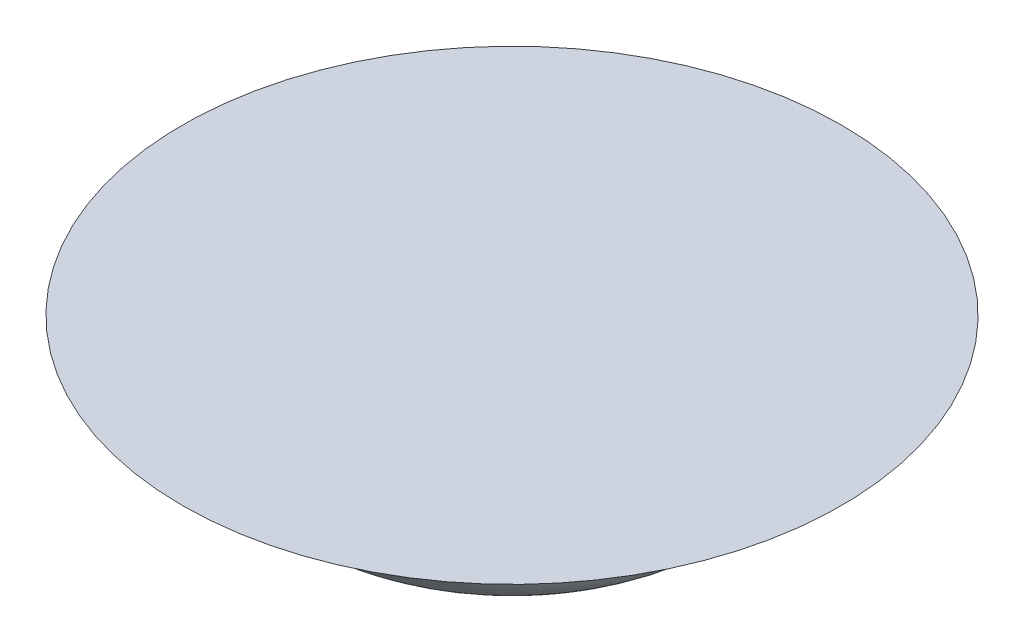
ISO-10303-21;
HEADER;
FILE_DESCRIPTION(('STEP AP214'),'2;1');
FILE_NAME('part.step','',(''),(''),'','','');
FILE_SCHEMA(('AUTOMOTIVE_DESIGN { 1 0 10303 214 1 1 1 1 }'));
ENDSEC;
DATA;
#1=APPLICATION_CONTEXT('core data for automotive mechanical design processes');
#2=APPLICATION_PROTOCOL_DEFINITION('international standard','automotive_design',2000,#1);
#3=PRODUCT_CONTEXT('',#1,'mechanical');
#4=PRODUCT('Part','Part','',(#3));
#5=PRODUCT_RELATED_PRODUCT_CATEGORY('part','',(#4));
#6=PRODUCT_DEFINITION_FORMATION('','',#4);
#7=PRODUCT_DEFINITION_CONTEXT('part definition',#1,'design');
#8=PRODUCT_DEFINITION('design','',#6,#7);
#9=PRODUCT_DEFINITION_SHAPE('','',#8);
#10=(LENGTH_UNIT() NAMED_UNIT(*) SI_UNIT(.MILLI.,.METRE.));
#11=(NAMED_UNIT(*) PLANE_ANGLE_UNIT() SI_UNIT($,.RADIAN.));
#12=(NAMED_UNIT(*) SI_UNIT($,.STERADIAN.) SOLID_ANGLE_UNIT());
#13=UNCERTAINTY_MEASURE_WITH_UNIT(LENGTH_MEASURE(1.E-05),#10,'distance_accuracy_value','');
#14=(GEOMETRIC_REPRESENTATION_CONTEXT(3) GLOBAL_UNCERTAINTY_ASSIGNED_CONTEXT((#13)) GLOBAL_UNIT_ASSIGNED_CONTEXT((#10,
#11,#12)) REPRESENTATION_CONTEXT('',''));
#15=CARTESIAN_POINT('',(0.,0.,0.));
#16=DIRECTION('',(0.,0.,1.));
#17=DIRECTION('',(1.,0.,0.));
#18=AXIS2_PLACEMENT_3D('',#15,#16,#17);
#19=CARTESIAN_POINT('',(0.,-5.,0.));
#20=DIRECTION('',(0.,-1.,0.));
#21=DIRECTION('',(0.,0.,-1.));
#22=AXIS2_PLACEMENT_3D('',#19,#20,#21);
#23=PLANE('',#22);
#24=CARTESIAN_POINT('',(0.,-5.,0.));
#25=DIRECTION('',(0.,-1.,0.));
#26=DIRECTION('',(0.,0.,-1.));
#27=AXIS2_PLACEMENT_3D('',#24,#25,#26);
#28=CIRCLE('',#27,7.);
#29=CARTESIAN_POINT('',(0.,-5.,-7.));
#30=VERTEX_POINT('',#29);
#31=EDGE_CURVE('E37',#30,#30,#28,.T.);
#32=ORIENTED_EDGE('',*,*,#31,.T.);
#33=EDGE_LOOP('',(#32));
#34=FACE_BOUND('',#33,.T.);
#35=ADVANCED_FACE('F30',(#34),#23,.T.);
#36=CARTESIAN_POINT('',(0.,-2.,0.));
#37=DIRECTION('',(0.,-1.,0.));
#38=DIRECTION('',(0.,0.,-1.));
#39=AXIS2_PLACEMENT_3D('',#36,#37,#38);
#40=TOROIDAL_SURFACE('',#39,7.,3.);
#41=CARTESIAN_POINT('',(0.,-3.125,0.));
#42=DIRECTION('',(0.,1.,0.));
#43=DIRECTION('',(0.,0.,1.));
#44=AXIS2_PLACEMENT_3D('',#41,#42,#43);
#45=CIRCLE('',#44,9.78107443266087);
#46=CARTESIAN_POINT('',(0.,-3.125,9.78107443266087));
#47=VERTEX_POINT('',#46);
#48=EDGE_CURVE('E10',#47,#47,#45,.F.);
#49=ORIENTED_EDGE('',*,*,#48,.T.);
#50=EDGE_LOOP('',(#49));
#51=FACE_BOUND('',#50,.T.);
#52=ORIENTED_EDGE('',*,*,#31,.F.);
#53=EDGE_LOOP('',(#52));
#54=FACE_BOUND('',#53,.T.);
#55=ADVANCED_FACE('F56',(#51,#54),#40,.T.);
#56=CARTESIAN_POINT('',(0.,-5.,0.));
#57=DIRECTION('',(0.,1.,0.));
#58=DIRECTION('',(0.,0.,1.));
#59=AXIS2_PLACEMENT_3D('',#56,#57,#58);
#60=TOROIDAL_SURFACE('',#59,14.4161984870957,5.);
#61=CARTESIAN_POINT('',(0.,0.,0.));
#62=DIRECTION('',(0.,1.,0.));
#63=DIRECTION('',(0.,0.,1.));
#64=AXIS2_PLACEMENT_3D('',#61,#62,#63);
#65=CIRCLE('',#64,14.4161984870957);
#66=CARTESIAN_POINT('',(0.,0.,14.4161984870957));
#67=VERTEX_POINT('',#66);
#68=EDGE_CURVE('E41',#67,#67,#65,.F.);
#69=ORIENTED_EDGE('',*,*,#68,.T.);
#70=EDGE_LOOP('',(#69));
#71=FACE_BOUND('',#70,.T.);
#72=ORIENTED_EDGE('',*,*,#48,.F.);
#73=EDGE_LOOP('',(#72));
#74=FACE_BOUND('',#73,.T.);
#75=ADVANCED_FACE('F32',(#71,#74),#60,.F.);
#76=CARTESIAN_POINT('',(-101.845255910092,0.,60.));
#77=DIRECTION('',(0.,-1.,0.));
#78=DIRECTION('',(0.,0.,-1.));
#79=AXIS2_PLACEMENT_3D('',#76,#77,#78);
#80=PLANE('',#79);
#81=ORIENTED_EDGE('',*,*,#68,.F.);
#82=EDGE_LOOP('',(#81));
#83=FACE_BOUND('',#82,.T.);
#84=ADVANCED_FACE('F50',(#83),#80,.F.);
#85=CLOSED_SHELL('',(#35,#55,#75,#84));
#86=MANIFOLD_SOLID_BREP('B2',#85);
#87=ADVANCED_BREP_SHAPE_REPRESENTATION('',(#18,#86),#14);
#88=SHAPE_DEFINITION_REPRESENTATION(#9,#87);
ENDSEC;
END-ISO-10303-21;
